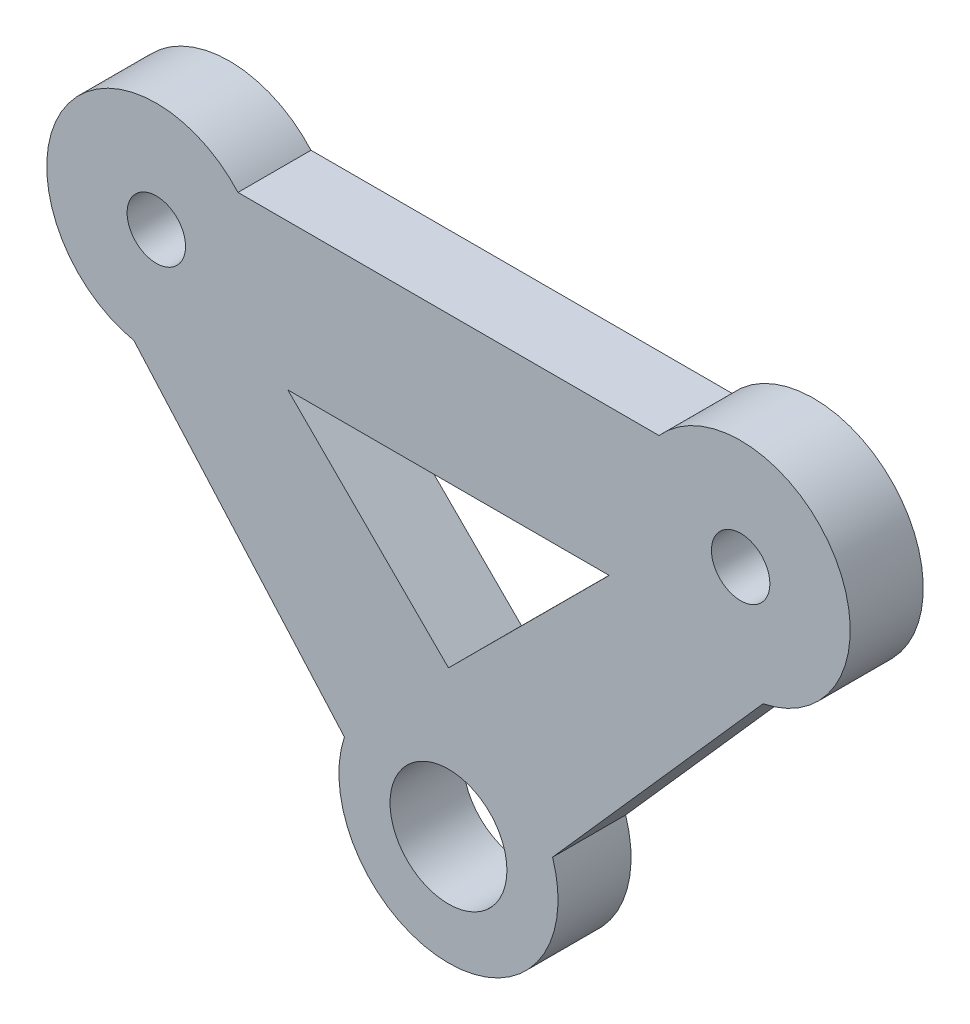
ISO-10303-21;
HEADER;
FILE_DESCRIPTION(('STEP AP214'),'2;1');
FILE_NAME('part.step','',(''),(''),'','','');
FILE_SCHEMA(('AUTOMOTIVE_DESIGN { 1 0 10303 214 1 1 1 1 }'));
ENDSEC;
DATA;
#1=APPLICATION_CONTEXT('core data for automotive mechanical design processes');
#2=APPLICATION_PROTOCOL_DEFINITION('international standard','automotive_design',2000,#1);
#3=PRODUCT_CONTEXT('',#1,'mechanical');
#4=PRODUCT('Part','Part','',(#3));
#5=PRODUCT_RELATED_PRODUCT_CATEGORY('part','',(#4));
#6=PRODUCT_DEFINITION_FORMATION('','',#4);
#7=PRODUCT_DEFINITION_CONTEXT('part definition',#1,'design');
#8=PRODUCT_DEFINITION('design','',#6,#7);
#9=PRODUCT_DEFINITION_SHAPE('','',#8);
#10=(LENGTH_UNIT() NAMED_UNIT(*) SI_UNIT(.MILLI.,.METRE.));
#11=(NAMED_UNIT(*) PLANE_ANGLE_UNIT() SI_UNIT($,.RADIAN.));
#12=(NAMED_UNIT(*) SI_UNIT($,.STERADIAN.) SOLID_ANGLE_UNIT());
#13=UNCERTAINTY_MEASURE_WITH_UNIT(LENGTH_MEASURE(1.E-05),#10,'distance_accuracy_value','');
#14=(GEOMETRIC_REPRESENTATION_CONTEXT(3) GLOBAL_UNCERTAINTY_ASSIGNED_CONTEXT((#13)) GLOBAL_UNIT_ASSIGNED_CONTEXT((#10,
#11,#12)) REPRESENTATION_CONTEXT('',''));
#15=CARTESIAN_POINT('',(0.,0.,0.));
#16=DIRECTION('',(0.,0.,1.));
#17=DIRECTION('',(1.,0.,0.));
#18=AXIS2_PLACEMENT_3D('',#15,#16,#17);
#19=CARTESIAN_POINT('',(0.,0.,5.));
#20=DIRECTION('',(0.,0.,1.));
#21=DIRECTION('',(1.,0.,0.));
#22=AXIS2_PLACEMENT_3D('',#19,#20,#21);
#23=PLANE('',#22);
#24=CARTESIAN_POINT('',(-20.,25.9807621135332,5.));
#25=DIRECTION('',(0.,0.,1.));
#26=DIRECTION('',(1.,0.,0.));
#27=AXIS2_PLACEMENT_3D('',#24,#25,#26);
#28=CIRCLE('',#27,2.);
#29=CARTESIAN_POINT('',(-18.,25.9807621135332,5.));
#30=VERTEX_POINT('',#29);
#31=EDGE_CURVE('E130',#30,#30,#28,.T.);
#32=ORIENTED_EDGE('',*,*,#31,.F.);
#33=EDGE_LOOP('',(#32));
#34=FACE_BOUND('',#33,.T.);
#35=CARTESIAN_POINT('',(0.,0.,5.));
#36=DIRECTION('',(0.,0.,1.));
#37=DIRECTION('',(1.,0.,0.));
#38=AXIS2_PLACEMENT_3D('',#35,#36,#37);
#39=CIRCLE('',#38,4.);
#40=CARTESIAN_POINT('',(4.,0.,5.));
#41=VERTEX_POINT('',#40);
#42=EDGE_CURVE('E142',#41,#41,#39,.T.);
#43=ORIENTED_EDGE('',*,*,#42,.F.);
#44=EDGE_LOOP('',(#43));
#45=FACE_BOUND('',#44,.T.);
#46=CARTESIAN_POINT('',(0.,0.,5.));
#47=DIRECTION('',(0.,0.,1.));
#48=DIRECTION('',(1.,0.,0.));
#49=AXIS2_PLACEMENT_3D('',#46,#47,#48);
#50=CIRCLE('',#49,7.5);
#51=CARTESIAN_POINT('',(-7.12521199079693,2.34122918275927,5.));
#52=VERTEX_POINT('',#51);
#53=CARTESIAN_POINT('',(7.12521199079693,2.34122918275927,5.));
#54=VERTEX_POINT('',#53);
#55=EDGE_CURVE('E148',#52,#54,#50,.T.);
#56=ORIENTED_EDGE('',*,*,#55,.T.);
#57=DIRECTION('',(0.662370135356907,0.749176750698574,0.));
#58=VECTOR('',#57,1.);
#59=CARTESIAN_POINT('',(7.12521199079693,2.34122918275927,5.));
#60=LINE('',#59,#58);
#61=CARTESIAN_POINT('',(21.5350420470475,18.6395329307739,5.));
#62=VERTEX_POINT('',#61);
#63=EDGE_CURVE('E151',#54,#62,#60,.T.);
#64=ORIENTED_EDGE('',*,*,#63,.T.);
#65=CARTESIAN_POINT('',(20.,25.9807621135332,5.));
#66=DIRECTION('',(0.,0.,1.));
#67=DIRECTION('',(1.,0.,0.));
#68=AXIS2_PLACEMENT_3D('',#65,#66,#67);
#69=CIRCLE('',#68,7.5);
#70=CARTESIAN_POINT('',(14.4098300562505,30.9807621135332,5.));
#71=VERTEX_POINT('',#70);
#72=EDGE_CURVE('E154',#62,#71,#69,.T.);
#73=ORIENTED_EDGE('',*,*,#72,.T.);
#74=DIRECTION('',(-1.,0.,0.));
#75=VECTOR('',#74,1.);
#76=CARTESIAN_POINT('',(14.4098300562505,30.9807621135332,5.));
#77=LINE('',#76,#75);
#78=CARTESIAN_POINT('',(-14.4098300562505,30.9807621135332,5.));
#79=VERTEX_POINT('',#78);
#80=EDGE_CURVE('E156',#71,#79,#77,.T.);
#81=ORIENTED_EDGE('',*,*,#80,.T.);
#82=CARTESIAN_POINT('',(-20.,25.9807621135332,5.));
#83=DIRECTION('',(0.,0.,1.));
#84=DIRECTION('',(1.,0.,0.));
#85=AXIS2_PLACEMENT_3D('',#82,#83,#84);
#86=CIRCLE('',#85,7.5);
#87=CARTESIAN_POINT('',(-21.5350420470475,18.6395329307739,5.));
#88=VERTEX_POINT('',#87);
#89=EDGE_CURVE('E158',#79,#88,#86,.T.);
#90=ORIENTED_EDGE('',*,*,#89,.T.);
#91=DIRECTION('',(0.662370135356907,-0.749176750698574,0.));
#92=VECTOR('',#91,1.);
#93=CARTESIAN_POINT('',(-21.5350420470475,18.6395329307739,5.));
#94=LINE('',#93,#92);
#95=EDGE_CURVE('E160',#88,#52,#94,.T.);
#96=ORIENTED_EDGE('',*,*,#95,.T.);
#97=EDGE_LOOP('',(#56,#64,#73,#81,#90,#96));
#98=FACE_BOUND('',#97,.T.);
#99=CARTESIAN_POINT('',(20.,25.9807621135332,5.));
#100=DIRECTION('',(0.,0.,1.));
#101=DIRECTION('',(1.,0.,0.));
#102=AXIS2_PLACEMENT_3D('',#99,#100,#101);
#103=CIRCLE('',#102,2.);
#104=CARTESIAN_POINT('',(22.,25.9807621135332,5.));
#105=VERTEX_POINT('',#104);
#106=EDGE_CURVE('E136',#105,#105,#103,.T.);
#107=ORIENTED_EDGE('',*,*,#106,.F.);
#108=EDGE_LOOP('',(#107));
#109=FACE_BOUND('',#108,.T.);
#110=DIRECTION('',(-1.,0.,0.));
#111=VECTOR('',#110,1.);
#112=CARTESIAN_POINT('',(11.,20.9807621135332,5.));
#113=LINE('',#112,#111);
#114=CARTESIAN_POINT('',(11.,20.9807621135332,5.));
#115=VERTEX_POINT('',#114);
#116=CARTESIAN_POINT('',(-11.,20.9807621135332,5.));
#117=VERTEX_POINT('',#116);
#118=EDGE_CURVE('E111',#115,#117,#113,.T.);
#119=ORIENTED_EDGE('',*,*,#118,.F.);
#120=DIRECTION('',(0.707725380388051,0.706487640340996,0.));
#121=VECTOR('',#120,1.);
#122=CARTESIAN_POINT('',(0.,10.,5.));
#123=LINE('',#122,#121);
#124=CARTESIAN_POINT('',(0.,10.,5.));
#125=VERTEX_POINT('',#124);
#126=EDGE_CURVE('E103',#125,#115,#123,.T.);
#127=ORIENTED_EDGE('',*,*,#126,.F.);
#128=DIRECTION('',(0.707725380388051,-0.706487640340996,0.));
#129=VECTOR('',#128,1.);
#130=CARTESIAN_POINT('',(-11.,20.9807621135332,5.));
#131=LINE('',#130,#129);
#132=EDGE_CURVE('E120',#117,#125,#131,.T.);
#133=ORIENTED_EDGE('',*,*,#132,.F.);
#134=EDGE_LOOP('',(#119,#127,#133));
#135=FACE_BOUND('',#134,.T.);
#136=ADVANCED_FACE('F32',(#34,#45,#98,#109,#135),#23,.T.);
#137=CARTESIAN_POINT('',(0.,0.,0.));
#138=DIRECTION('',(0.,0.,1.));
#139=DIRECTION('',(1.,0.,0.));
#140=AXIS2_PLACEMENT_3D('',#137,#138,#139);
#141=PLANE('',#140);
#142=CARTESIAN_POINT('',(-20.,25.9807621135332,0.));
#143=DIRECTION('',(0.,0.,1.));
#144=DIRECTION('',(1.,0.,0.));
#145=AXIS2_PLACEMENT_3D('',#142,#143,#144);
#146=CIRCLE('',#145,2.);
#147=CARTESIAN_POINT('',(-18.,25.9807621135332,0.));
#148=VERTEX_POINT('',#147);
#149=EDGE_CURVE('E118',#148,#148,#146,.T.);
#150=ORIENTED_EDGE('',*,*,#149,.T.);
#151=EDGE_LOOP('',(#150));
#152=FACE_BOUND('',#151,.T.);
#153=CARTESIAN_POINT('',(0.,0.,0.));
#154=DIRECTION('',(0.,0.,1.));
#155=DIRECTION('',(1.,0.,0.));
#156=AXIS2_PLACEMENT_3D('',#153,#154,#155);
#157=CIRCLE('',#156,4.);
#158=CARTESIAN_POINT('',(4.,0.,0.));
#159=VERTEX_POINT('',#158);
#160=EDGE_CURVE('E139',#159,#159,#157,.T.);
#161=ORIENTED_EDGE('',*,*,#160,.T.);
#162=EDGE_LOOP('',(#161));
#163=FACE_BOUND('',#162,.T.);
#164=CARTESIAN_POINT('',(0.,0.,0.));
#165=DIRECTION('',(0.,0.,1.));
#166=DIRECTION('',(1.,0.,0.));
#167=AXIS2_PLACEMENT_3D('',#164,#165,#166);
#168=CIRCLE('',#167,7.5);
#169=CARTESIAN_POINT('',(-7.12521199079693,2.34122918275927,0.));
#170=VERTEX_POINT('',#169);
#171=CARTESIAN_POINT('',(7.12521199079693,2.34122918275927,0.));
#172=VERTEX_POINT('',#171);
#173=EDGE_CURVE('E145',#170,#172,#168,.T.);
#174=ORIENTED_EDGE('',*,*,#173,.F.);
#175=DIRECTION('',(0.662370135356907,-0.749176750698574,0.));
#176=VECTOR('',#175,1.);
#177=CARTESIAN_POINT('',(-21.5350420470475,18.6395329307739,0.));
#178=LINE('',#177,#176);
#179=CARTESIAN_POINT('',(-21.5350420470475,18.6395329307739,0.));
#180=VERTEX_POINT('',#179);
#181=EDGE_CURVE('E152',#180,#170,#178,.T.);
#182=ORIENTED_EDGE('',*,*,#181,.F.);
#183=CARTESIAN_POINT('',(-20.,25.9807621135332,0.));
#184=DIRECTION('',(0.,0.,1.));
#185=DIRECTION('',(1.,0.,0.));
#186=AXIS2_PLACEMENT_3D('',#183,#184,#185);
#187=CIRCLE('',#186,7.5);
#188=CARTESIAN_POINT('',(-14.4098300562505,30.9807621135332,0.));
#189=VERTEX_POINT('',#188);
#190=EDGE_CURVE('E171',#189,#180,#187,.T.);
#191=ORIENTED_EDGE('',*,*,#190,.F.);
#192=DIRECTION('',(-1.,0.,0.));
#193=VECTOR('',#192,1.);
#194=CARTESIAN_POINT('',(14.4098300562505,30.9807621135332,0.));
#195=LINE('',#194,#193);
#196=CARTESIAN_POINT('',(14.4098300562505,30.9807621135332,0.));
#197=VERTEX_POINT('',#196);
#198=EDGE_CURVE('E169',#197,#189,#195,.T.);
#199=ORIENTED_EDGE('',*,*,#198,.F.);
#200=CARTESIAN_POINT('',(20.,25.9807621135332,0.));
#201=DIRECTION('',(0.,0.,1.));
#202=DIRECTION('',(1.,0.,0.));
#203=AXIS2_PLACEMENT_3D('',#200,#201,#202);
#204=CIRCLE('',#203,7.5);
#205=CARTESIAN_POINT('',(21.5350420470475,18.6395329307739,0.));
#206=VERTEX_POINT('',#205);
#207=EDGE_CURVE('E167',#206,#197,#204,.T.);
#208=ORIENTED_EDGE('',*,*,#207,.F.);
#209=DIRECTION('',(0.662370135356907,0.749176750698574,0.));
#210=VECTOR('',#209,1.);
#211=CARTESIAN_POINT('',(7.12521199079693,2.34122918275927,0.));
#212=LINE('',#211,#210);
#213=EDGE_CURVE('E165',#172,#206,#212,.T.);
#214=ORIENTED_EDGE('',*,*,#213,.F.);
#215=EDGE_LOOP('',(#174,#182,#191,#199,#208,#214));
#216=FACE_BOUND('',#215,.T.);
#217=CARTESIAN_POINT('',(20.,25.9807621135332,0.));
#218=DIRECTION('',(0.,0.,1.));
#219=DIRECTION('',(1.,0.,0.));
#220=AXIS2_PLACEMENT_3D('',#217,#218,#219);
#221=CIRCLE('',#220,2.);
#222=CARTESIAN_POINT('',(22.,25.9807621135332,0.));
#223=VERTEX_POINT('',#222);
#224=EDGE_CURVE('E133',#223,#223,#221,.T.);
#225=ORIENTED_EDGE('',*,*,#224,.T.);
#226=EDGE_LOOP('',(#225));
#227=FACE_BOUND('',#226,.T.);
#228=DIRECTION('',(0.707725380388051,0.706487640340996,0.));
#229=VECTOR('',#228,1.);
#230=CARTESIAN_POINT('',(0.,10.,0.));
#231=LINE('',#230,#229);
#232=CARTESIAN_POINT('',(0.,10.,0.));
#233=VERTEX_POINT('',#232);
#234=CARTESIAN_POINT('',(11.,20.9807621135332,0.));
#235=VERTEX_POINT('',#234);
#236=EDGE_CURVE('E55',#233,#235,#231,.T.);
#237=ORIENTED_EDGE('',*,*,#236,.T.);
#238=DIRECTION('',(-1.,0.,0.));
#239=VECTOR('',#238,1.);
#240=CARTESIAN_POINT('',(11.,20.9807621135332,0.));
#241=LINE('',#240,#239);
#242=CARTESIAN_POINT('',(-11.,20.9807621135332,0.));
#243=VERTEX_POINT('',#242);
#244=EDGE_CURVE('E117',#235,#243,#241,.T.);
#245=ORIENTED_EDGE('',*,*,#244,.T.);
#246=DIRECTION('',(0.707725380388051,-0.706487640340996,0.));
#247=VECTOR('',#246,1.);
#248=CARTESIAN_POINT('',(-11.,20.9807621135332,0.));
#249=LINE('',#248,#247);
#250=EDGE_CURVE('E112',#243,#233,#249,.T.);
#251=ORIENTED_EDGE('',*,*,#250,.T.);
#252=EDGE_LOOP('',(#237,#245,#251));
#253=FACE_BOUND('',#252,.T.);
#254=ADVANCED_FACE('F195',(#152,#163,#216,#227,#253),#141,.F.);
#255=CARTESIAN_POINT('',(0.,0.,5.));
#256=DIRECTION('',(0.,0.,-1.));
#257=DIRECTION('',(-1.,0.,0.));
#258=AXIS2_PLACEMENT_3D('',#255,#256,#257);
#259=CYLINDRICAL_SURFACE('',#258,7.5);
#260=ORIENTED_EDGE('',*,*,#173,.T.);
#261=DIRECTION('',(0.,0.,-1.));
#262=VECTOR('',#261,1.);
#263=CARTESIAN_POINT('',(7.12521199079693,2.34122918275927,5.));
#264=LINE('',#263,#262);
#265=EDGE_CURVE('E11',#54,#172,#264,.T.);
#266=ORIENTED_EDGE('',*,*,#265,.F.);
#267=ORIENTED_EDGE('',*,*,#55,.F.);
#268=DIRECTION('',(0.,0.,-1.));
#269=VECTOR('',#268,1.);
#270=CARTESIAN_POINT('',(-7.12521199079693,2.34122918275927,5.));
#271=LINE('',#270,#269);
#272=EDGE_CURVE('E162',#52,#170,#271,.T.);
#273=ORIENTED_EDGE('',*,*,#272,.T.);
#274=EDGE_LOOP('',(#260,#266,#267,#273));
#275=FACE_BOUND('',#274,.T.);
#276=ADVANCED_FACE('F34',(#275),#259,.T.);
#277=CARTESIAN_POINT('',(7.12521199079693,2.34122918275927,5.));
#278=DIRECTION('',(-0.749176750698574,0.662370135356907,0.));
#279=DIRECTION('',(-0.662370135356907,-0.749176750698574,0.));
#280=AXIS2_PLACEMENT_3D('',#277,#278,#279);
#281=PLANE('',#280);
#282=ORIENTED_EDGE('',*,*,#213,.T.);
#283=DIRECTION('',(0.,0.,-1.));
#284=VECTOR('',#283,1.);
#285=CARTESIAN_POINT('',(21.5350420470475,18.6395329307739,5.));
#286=LINE('',#285,#284);
#287=EDGE_CURVE('E40',#62,#206,#286,.T.);
#288=ORIENTED_EDGE('',*,*,#287,.F.);
#289=ORIENTED_EDGE('',*,*,#63,.F.);
#290=ORIENTED_EDGE('',*,*,#265,.T.);
#291=EDGE_LOOP('',(#282,#288,#289,#290));
#292=FACE_BOUND('',#291,.T.);
#293=ADVANCED_FACE('F213',(#292),#281,.F.);
#294=CARTESIAN_POINT('',(20.,25.9807621135332,5.));
#295=DIRECTION('',(0.,0.,-1.));
#296=DIRECTION('',(-1.,0.,0.));
#297=AXIS2_PLACEMENT_3D('',#294,#295,#296);
#298=CYLINDRICAL_SURFACE('',#297,7.5);
#299=ORIENTED_EDGE('',*,*,#207,.T.);
#300=DIRECTION('',(0.,0.,-1.));
#301=VECTOR('',#300,1.);
#302=CARTESIAN_POINT('',(14.4098300562505,30.9807621135332,5.));
#303=LINE('',#302,#301);
#304=EDGE_CURVE('E182',#71,#197,#303,.T.);
#305=ORIENTED_EDGE('',*,*,#304,.F.);
#306=ORIENTED_EDGE('',*,*,#72,.F.);
#307=ORIENTED_EDGE('',*,*,#287,.T.);
#308=EDGE_LOOP('',(#299,#305,#306,#307));
#309=FACE_BOUND('',#308,.T.);
#310=ADVANCED_FACE('F189',(#309),#298,.T.);
#311=CARTESIAN_POINT('',(14.4098300562505,30.9807621135332,5.));
#312=DIRECTION('',(0.,-1.,0.));
#313=DIRECTION('',(1.,0.,0.));
#314=AXIS2_PLACEMENT_3D('',#311,#312,#313);
#315=PLANE('',#314);
#316=ORIENTED_EDGE('',*,*,#198,.T.);
#317=DIRECTION('',(0.,0.,-1.));
#318=VECTOR('',#317,1.);
#319=CARTESIAN_POINT('',(-14.4098300562505,30.9807621135332,5.));
#320=LINE('',#319,#318);
#321=EDGE_CURVE('E179',#79,#189,#320,.T.);
#322=ORIENTED_EDGE('',*,*,#321,.F.);
#323=ORIENTED_EDGE('',*,*,#80,.F.);
#324=ORIENTED_EDGE('',*,*,#304,.T.);
#325=EDGE_LOOP('',(#316,#322,#323,#324));
#326=FACE_BOUND('',#325,.T.);
#327=ADVANCED_FACE('F201',(#326),#315,.F.);
#328=CARTESIAN_POINT('',(-20.,25.9807621135332,5.));
#329=DIRECTION('',(0.,0.,-1.));
#330=DIRECTION('',(-1.,0.,0.));
#331=AXIS2_PLACEMENT_3D('',#328,#329,#330);
#332=CYLINDRICAL_SURFACE('',#331,7.5);
#333=ORIENTED_EDGE('',*,*,#190,.T.);
#334=DIRECTION('',(0.,0.,-1.));
#335=VECTOR('',#334,1.);
#336=CARTESIAN_POINT('',(-21.5350420470475,18.6395329307739,5.));
#337=LINE('',#336,#335);
#338=EDGE_CURVE('E176',#88,#180,#337,.T.);
#339=ORIENTED_EDGE('',*,*,#338,.F.);
#340=ORIENTED_EDGE('',*,*,#89,.F.);
#341=ORIENTED_EDGE('',*,*,#321,.T.);
#342=EDGE_LOOP('',(#333,#339,#340,#341));
#343=FACE_BOUND('',#342,.T.);
#344=ADVANCED_FACE('F205',(#343),#332,.T.);
#345=CARTESIAN_POINT('',(-21.5350420470475,18.6395329307739,5.));
#346=DIRECTION('',(0.749176750698574,0.662370135356907,0.));
#347=DIRECTION('',(-0.662370135356907,0.749176750698574,0.));
#348=AXIS2_PLACEMENT_3D('',#345,#346,#347);
#349=PLANE('',#348);
#350=ORIENTED_EDGE('',*,*,#181,.T.);
#351=ORIENTED_EDGE('',*,*,#272,.F.);
#352=ORIENTED_EDGE('',*,*,#95,.F.);
#353=ORIENTED_EDGE('',*,*,#338,.T.);
#354=EDGE_LOOP('',(#350,#351,#352,#353));
#355=FACE_BOUND('',#354,.T.);
#356=ADVANCED_FACE('F216',(#355),#349,.F.);
#357=CARTESIAN_POINT('',(0.,0.,5.));
#358=DIRECTION('',(0.,0.,-1.));
#359=DIRECTION('',(-1.,0.,0.));
#360=AXIS2_PLACEMENT_3D('',#357,#358,#359);
#361=CYLINDRICAL_SURFACE('',#360,4.);
#362=ORIENTED_EDGE('',*,*,#42,.T.);
#363=EDGE_LOOP('',(#362));
#364=FACE_BOUND('',#363,.T.);
#365=ORIENTED_EDGE('',*,*,#160,.F.);
#366=EDGE_LOOP('',(#365));
#367=FACE_BOUND('',#366,.T.);
#368=ADVANCED_FACE('F218',(#364,#367),#361,.F.);
#369=CARTESIAN_POINT('',(20.,25.9807621135332,5.));
#370=DIRECTION('',(0.,0.,-1.));
#371=DIRECTION('',(-1.,0.,0.));
#372=AXIS2_PLACEMENT_3D('',#369,#370,#371);
#373=CYLINDRICAL_SURFACE('',#372,2.);
#374=ORIENTED_EDGE('',*,*,#106,.T.);
#375=EDGE_LOOP('',(#374));
#376=FACE_BOUND('',#375,.T.);
#377=ORIENTED_EDGE('',*,*,#224,.F.);
#378=EDGE_LOOP('',(#377));
#379=FACE_BOUND('',#378,.T.);
#380=ADVANCED_FACE('F224',(#376,#379),#373,.F.);
#381=CARTESIAN_POINT('',(-20.,25.9807621135332,5.));
#382=DIRECTION('',(0.,0.,-1.));
#383=DIRECTION('',(-1.,0.,0.));
#384=AXIS2_PLACEMENT_3D('',#381,#382,#383);
#385=CYLINDRICAL_SURFACE('',#384,2.);
#386=ORIENTED_EDGE('',*,*,#31,.T.);
#387=EDGE_LOOP('',(#386));
#388=FACE_BOUND('',#387,.T.);
#389=ORIENTED_EDGE('',*,*,#149,.F.);
#390=EDGE_LOOP('',(#389));
#391=FACE_BOUND('',#390,.T.);
#392=ADVANCED_FACE('F241',(#388,#391),#385,.F.);
#393=CARTESIAN_POINT('',(0.,10.,5.));
#394=DIRECTION('',(-0.706487640340996,0.707725380388051,0.));
#395=DIRECTION('',(-0.707725380388051,-0.706487640340996,0.));
#396=AXIS2_PLACEMENT_3D('',#393,#394,#395);
#397=PLANE('',#396);
#398=ORIENTED_EDGE('',*,*,#236,.F.);
#399=DIRECTION('',(0.,0.,-1.));
#400=VECTOR('',#399,1.);
#401=CARTESIAN_POINT('',(0.,10.,5.));
#402=LINE('',#401,#400);
#403=EDGE_CURVE('E107',#125,#233,#402,.T.);
#404=ORIENTED_EDGE('',*,*,#403,.F.);
#405=ORIENTED_EDGE('',*,*,#126,.T.);
#406=DIRECTION('',(0.,0.,-1.));
#407=VECTOR('',#406,1.);
#408=CARTESIAN_POINT('',(11.,20.9807621135332,5.));
#409=LINE('',#408,#407);
#410=EDGE_CURVE('E106',#115,#235,#409,.T.);
#411=ORIENTED_EDGE('',*,*,#410,.T.);
#412=EDGE_LOOP('',(#398,#404,#405,#411));
#413=FACE_BOUND('',#412,.T.);
#414=ADVANCED_FACE('F105',(#413),#397,.T.);
#415=CARTESIAN_POINT('',(11.,20.9807621135332,5.));
#416=DIRECTION('',(0.,-1.,0.));
#417=DIRECTION('',(0.,0.,-1.));
#418=AXIS2_PLACEMENT_3D('',#415,#416,#417);
#419=PLANE('',#418);
#420=ORIENTED_EDGE('',*,*,#244,.F.);
#421=ORIENTED_EDGE('',*,*,#410,.F.);
#422=ORIENTED_EDGE('',*,*,#118,.T.);
#423=DIRECTION('',(0.,0.,-1.));
#424=VECTOR('',#423,1.);
#425=CARTESIAN_POINT('',(-11.,20.9807621135332,5.));
#426=LINE('',#425,#424);
#427=EDGE_CURVE('E47',#117,#243,#426,.T.);
#428=ORIENTED_EDGE('',*,*,#427,.T.);
#429=EDGE_LOOP('',(#420,#421,#422,#428));
#430=FACE_BOUND('',#429,.T.);
#431=ADVANCED_FACE('F115',(#430),#419,.T.);
#432=CARTESIAN_POINT('',(-11.,20.9807621135332,5.));
#433=DIRECTION('',(0.706487640340996,0.707725380388051,0.));
#434=DIRECTION('',(-0.707725380388051,0.706487640340996,0.));
#435=AXIS2_PLACEMENT_3D('',#432,#433,#434);
#436=PLANE('',#435);
#437=ORIENTED_EDGE('',*,*,#250,.F.);
#438=ORIENTED_EDGE('',*,*,#427,.F.);
#439=ORIENTED_EDGE('',*,*,#132,.T.);
#440=ORIENTED_EDGE('',*,*,#403,.T.);
#441=EDGE_LOOP('',(#437,#438,#439,#440));
#442=FACE_BOUND('',#441,.T.);
#443=ADVANCED_FACE('F250',(#442),#436,.T.);
#444=CLOSED_SHELL('',(#136,#254,#276,#293,#310,#327,#344,#356,#368,#380,#392,#414,#431,#443));
#445=MANIFOLD_SOLID_BREP('B2',#444);
#446=ADVANCED_BREP_SHAPE_REPRESENTATION('',(#18,#445),#14);
#447=SHAPE_DEFINITION_REPRESENTATION(#9,#446);
ENDSEC;
END-ISO-10303-21;
